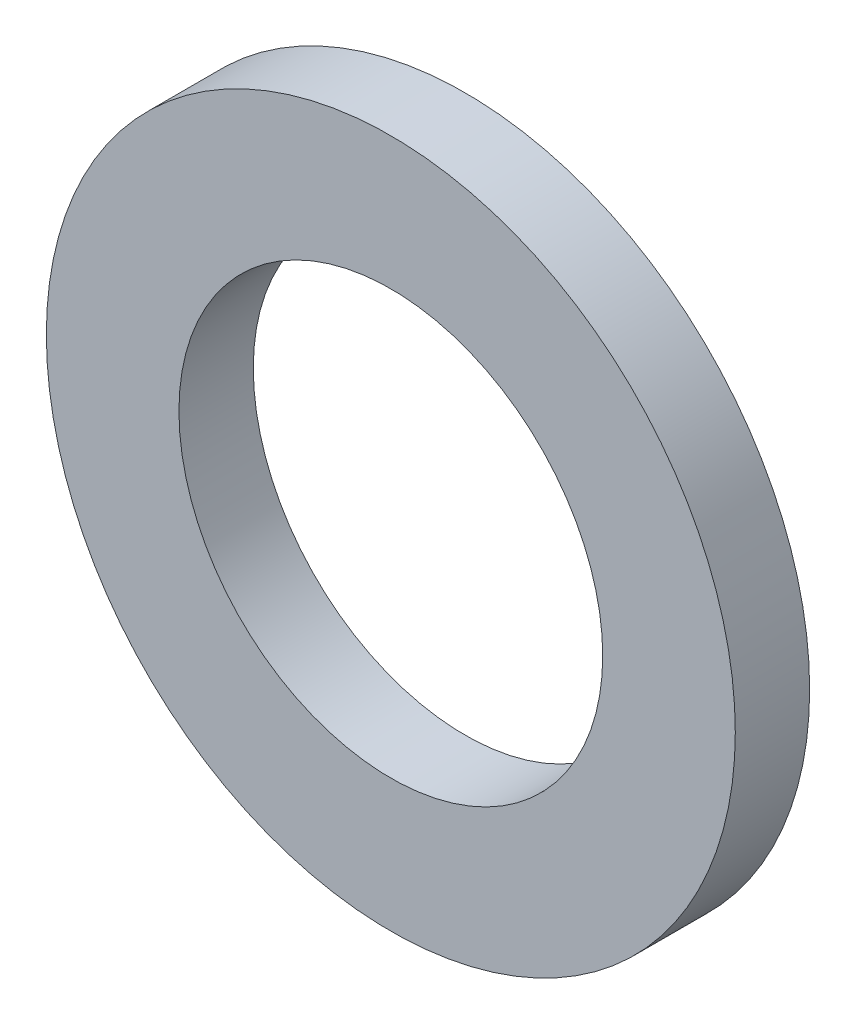
ISO-10303-21;
HEADER;
FILE_DESCRIPTION(('STEP AP214'),'2;1');
FILE_NAME('part.step','',(''),(''),'','','');
FILE_SCHEMA(('AUTOMOTIVE_DESIGN { 1 0 10303 214 1 1 1 1 }'));
ENDSEC;
DATA;
#1=APPLICATION_CONTEXT('core data for automotive mechanical design processes');
#2=APPLICATION_PROTOCOL_DEFINITION('international standard','automotive_design',2000,#1);
#3=PRODUCT_CONTEXT('',#1,'mechanical');
#4=PRODUCT('Part','Part','',(#3));
#5=PRODUCT_RELATED_PRODUCT_CATEGORY('part','',(#4));
#6=PRODUCT_DEFINITION_FORMATION('','',#4);
#7=PRODUCT_DEFINITION_CONTEXT('part definition',#1,'design');
#8=PRODUCT_DEFINITION('design','',#6,#7);
#9=PRODUCT_DEFINITION_SHAPE('','',#8);
#10=(LENGTH_UNIT() NAMED_UNIT(*) SI_UNIT(.MILLI.,.METRE.));
#11=(NAMED_UNIT(*) PLANE_ANGLE_UNIT() SI_UNIT($,.RADIAN.));
#12=(NAMED_UNIT(*) SI_UNIT($,.STERADIAN.) SOLID_ANGLE_UNIT());
#13=UNCERTAINTY_MEASURE_WITH_UNIT(LENGTH_MEASURE(1.E-05),#10,'distance_accuracy_value','');
#14=(GEOMETRIC_REPRESENTATION_CONTEXT(3) GLOBAL_UNCERTAINTY_ASSIGNED_CONTEXT((#13)) GLOBAL_UNIT_ASSIGNED_CONTEXT((#10,
#11,#12)) REPRESENTATION_CONTEXT('',''));
#15=CARTESIAN_POINT('',(0.,0.,0.));
#16=DIRECTION('',(0.,0.,1.));
#17=DIRECTION('',(1.,0.,0.));
#18=AXIS2_PLACEMENT_3D('',#15,#16,#17);
#19=CARTESIAN_POINT('',(0.,13.9,1.5));
#20=DIRECTION('',(0.,0.,-1.));
#21=DIRECTION('',(-1.,0.,0.));
#22=AXIS2_PLACEMENT_3D('',#19,#20,#21);
#23=PLANE('',#22);
#24=CARTESIAN_POINT('',(0.,0.,1.5));
#25=DIRECTION('',(0.,0.,1.));
#26=DIRECTION('',(1.,0.,0.));
#27=AXIS2_PLACEMENT_3D('',#24,#25,#26);
#28=CIRCLE('',#27,8.55);
#29=CARTESIAN_POINT('',(8.55,0.,1.5));
#30=VERTEX_POINT('',#29);
#31=EDGE_CURVE('E10',#30,#30,#28,.T.);
#32=ORIENTED_EDGE('',*,*,#31,.F.);
#33=EDGE_LOOP('',(#32));
#34=FACE_BOUND('',#33,.T.);
#35=CARTESIAN_POINT('',(0.,0.,1.5));
#36=DIRECTION('',(0.,0.,1.));
#37=DIRECTION('',(1.,0.,0.));
#38=AXIS2_PLACEMENT_3D('',#35,#36,#37);
#39=CIRCLE('',#38,13.9);
#40=CARTESIAN_POINT('',(13.9,0.,1.5));
#41=VERTEX_POINT('',#40);
#42=EDGE_CURVE('E57',#41,#41,#39,.T.);
#43=ORIENTED_EDGE('',*,*,#42,.T.);
#44=EDGE_LOOP('',(#43));
#45=FACE_BOUND('',#44,.T.);
#46=ADVANCED_FACE('F43',(#34,#45),#23,.F.);
#47=CARTESIAN_POINT('',(0.,0.,0.));
#48=DIRECTION('',(0.,0.,1.));
#49=DIRECTION('',(1.,0.,0.));
#50=AXIS2_PLACEMENT_3D('',#47,#48,#49);
#51=CYLINDRICAL_SURFACE('',#50,8.55);
#52=CARTESIAN_POINT('',(0.,0.,-1.5));
#53=DIRECTION('',(0.,0.,1.));
#54=DIRECTION('',(1.,0.,0.));
#55=AXIS2_PLACEMENT_3D('',#52,#53,#54);
#56=CIRCLE('',#55,8.55);
#57=CARTESIAN_POINT('',(8.55,0.,-1.5));
#58=VERTEX_POINT('',#57);
#59=EDGE_CURVE('E49',#58,#58,#56,.T.);
#60=ORIENTED_EDGE('',*,*,#59,.F.);
#61=EDGE_LOOP('',(#60));
#62=FACE_BOUND('',#61,.T.);
#63=ORIENTED_EDGE('',*,*,#31,.T.);
#64=EDGE_LOOP('',(#63));
#65=FACE_BOUND('',#64,.T.);
#66=ADVANCED_FACE('F72',(#62,#65),#51,.F.);
#67=CARTESIAN_POINT('',(0.,13.9,-1.5));
#68=DIRECTION('',(0.,0.,1.));
#69=DIRECTION('',(1.,0.,0.));
#70=AXIS2_PLACEMENT_3D('',#67,#68,#69);
#71=PLANE('',#70);
#72=CARTESIAN_POINT('',(0.,0.,-1.5));
#73=DIRECTION('',(0.,0.,1.));
#74=DIRECTION('',(1.,0.,0.));
#75=AXIS2_PLACEMENT_3D('',#72,#73,#74);
#76=CIRCLE('',#75,13.9);
#77=CARTESIAN_POINT('',(13.9,0.,-1.5));
#78=VERTEX_POINT('',#77);
#79=EDGE_CURVE('E53',#78,#78,#76,.T.);
#80=ORIENTED_EDGE('',*,*,#79,.F.);
#81=EDGE_LOOP('',(#80));
#82=FACE_BOUND('',#81,.T.);
#83=ORIENTED_EDGE('',*,*,#59,.T.);
#84=EDGE_LOOP('',(#83));
#85=FACE_BOUND('',#84,.T.);
#86=ADVANCED_FACE('F67',(#82,#85),#71,.F.);
#87=CARTESIAN_POINT('',(0.,0.,0.));
#88=DIRECTION('',(0.,0.,1.));
#89=DIRECTION('',(1.,0.,0.));
#90=AXIS2_PLACEMENT_3D('',#87,#88,#89);
#91=CYLINDRICAL_SURFACE('',#90,13.9);
#92=ORIENTED_EDGE('',*,*,#42,.F.);
#93=EDGE_LOOP('',(#92));
#94=FACE_BOUND('',#93,.T.);
#95=ORIENTED_EDGE('',*,*,#79,.T.);
#96=EDGE_LOOP('',(#95));
#97=FACE_BOUND('',#96,.T.);
#98=ADVANCED_FACE('F64',(#94,#97),#91,.T.);
#99=CLOSED_SHELL('',(#46,#66,#86,#98));
#100=MANIFOLD_SOLID_BREP('B2',#99);
#101=ADVANCED_BREP_SHAPE_REPRESENTATION('',(#18,#100),#14);
#102=SHAPE_DEFINITION_REPRESENTATION(#9,#101);
ENDSEC;
END-ISO-10303-21;
